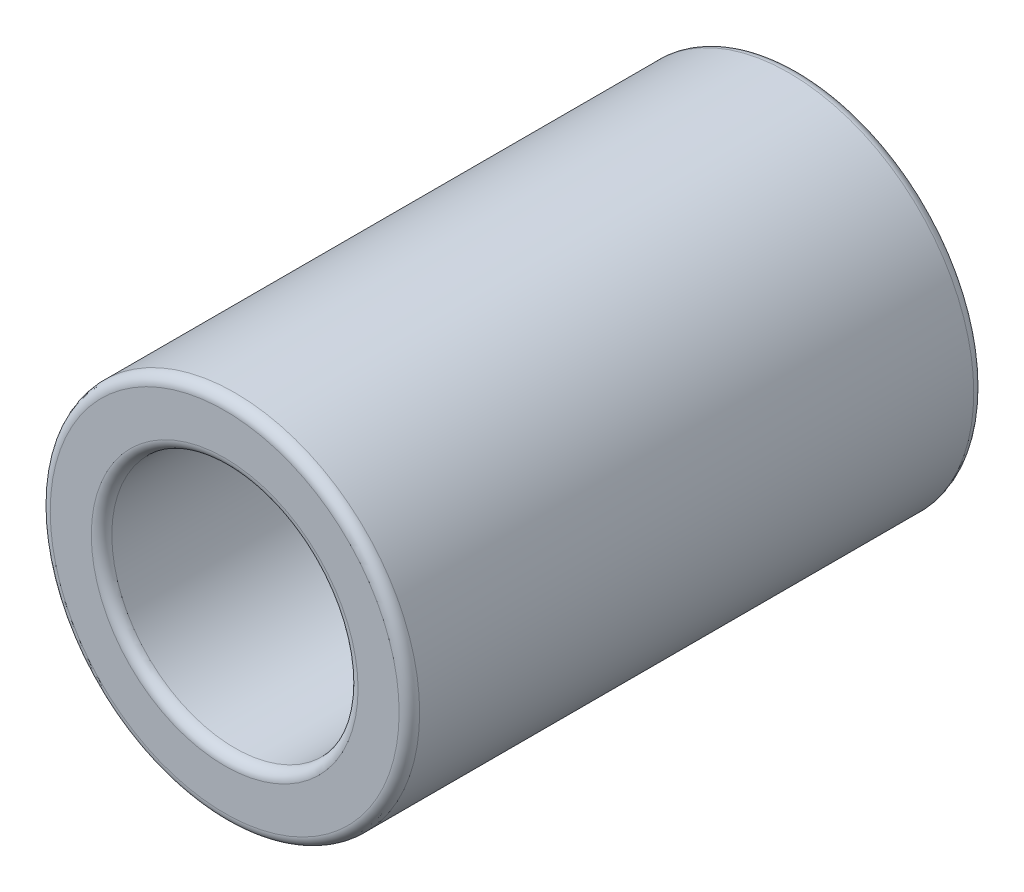
ISO-10303-21;
HEADER;
FILE_DESCRIPTION(('STEP AP214'),'2;1');
FILE_NAME('part.step','',(''),(''),'','','');
FILE_SCHEMA(('AUTOMOTIVE_DESIGN { 1 0 10303 214 1 1 1 1 }'));
ENDSEC;
DATA;
#1=APPLICATION_CONTEXT('core data for automotive mechanical design processes');
#2=APPLICATION_PROTOCOL_DEFINITION('international standard','automotive_design',2000,#1);
#3=PRODUCT_CONTEXT('',#1,'mechanical');
#4=PRODUCT('Part','Part','',(#3));
#5=PRODUCT_RELATED_PRODUCT_CATEGORY('part','',(#4));
#6=PRODUCT_DEFINITION_FORMATION('','',#4);
#7=PRODUCT_DEFINITION_CONTEXT('part definition',#1,'design');
#8=PRODUCT_DEFINITION('design','',#6,#7);
#9=PRODUCT_DEFINITION_SHAPE('','',#8);
#10=(LENGTH_UNIT() NAMED_UNIT(*) SI_UNIT(.MILLI.,.METRE.));
#11=(NAMED_UNIT(*) PLANE_ANGLE_UNIT() SI_UNIT($,.RADIAN.));
#12=(NAMED_UNIT(*) SI_UNIT($,.STERADIAN.) SOLID_ANGLE_UNIT());
#13=UNCERTAINTY_MEASURE_WITH_UNIT(LENGTH_MEASURE(1.E-05),#10,'distance_accuracy_value','');
#14=(GEOMETRIC_REPRESENTATION_CONTEXT(3) GLOBAL_UNCERTAINTY_ASSIGNED_CONTEXT((#13)) GLOBAL_UNIT_ASSIGNED_CONTEXT((#10,
#11,#12)) REPRESENTATION_CONTEXT('',''));
#15=CARTESIAN_POINT('',(0.,0.,0.));
#16=DIRECTION('',(0.,0.,1.));
#17=DIRECTION('',(1.,0.,0.));
#18=AXIS2_PLACEMENT_3D('',#15,#16,#17);
#19=CARTESIAN_POINT('',(0.,0.,28.));
#20=DIRECTION('',(0.,0.,1.));
#21=DIRECTION('',(1.,0.,0.));
#22=AXIS2_PLACEMENT_3D('',#19,#20,#21);
#23=PLANE('',#22);
#24=CARTESIAN_POINT('',(0.,0.,28.));
#25=DIRECTION('',(0.,0.,1.));
#26=DIRECTION('',(1.,0.,0.));
#27=AXIS2_PLACEMENT_3D('',#24,#25,#26);
#28=CIRCLE('',#27,17.);
#29=CARTESIAN_POINT('',(17.,0.,28.));
#30=VERTEX_POINT('',#29);
#31=EDGE_CURVE('E55',#30,#30,#28,.T.);
#32=ORIENTED_EDGE('',*,*,#31,.T.);
#33=EDGE_LOOP('',(#32));
#34=FACE_BOUND('',#33,.T.);
#35=CARTESIAN_POINT('',(0.,0.,28.));
#36=DIRECTION('',(0.,0.,1.));
#37=DIRECTION('',(1.,0.,0.));
#38=AXIS2_PLACEMENT_3D('',#35,#36,#37);
#39=CIRCLE('',#38,13.);
#40=CARTESIAN_POINT('',(13.,0.,28.));
#41=VERTEX_POINT('',#40);
#42=EDGE_CURVE('E59',#41,#41,#39,.F.);
#43=ORIENTED_EDGE('',*,*,#42,.T.);
#44=EDGE_LOOP('',(#43));
#45=FACE_BOUND('',#44,.T.);
#46=ADVANCED_FACE('F44',(#34,#45),#23,.T.);
#47=CARTESIAN_POINT('',(0.,0.,-28.));
#48=DIRECTION('',(0.,0.,1.));
#49=DIRECTION('',(1.,0.,0.));
#50=AXIS2_PLACEMENT_3D('',#47,#48,#49);
#51=PLANE('',#50);
#52=CARTESIAN_POINT('',(0.,0.,-28.));
#53=DIRECTION('',(0.,0.,1.));
#54=DIRECTION('',(1.,0.,0.));
#55=AXIS2_PLACEMENT_3D('',#52,#53,#54);
#56=CIRCLE('',#55,17.);
#57=CARTESIAN_POINT('',(17.,0.,-28.));
#58=VERTEX_POINT('',#57);
#59=EDGE_CURVE('E64',#58,#58,#56,.F.);
#60=ORIENTED_EDGE('',*,*,#59,.T.);
#61=EDGE_LOOP('',(#60));
#62=FACE_BOUND('',#61,.T.);
#63=CARTESIAN_POINT('',(0.,0.,-28.));
#64=DIRECTION('',(0.,0.,1.));
#65=DIRECTION('',(1.,0.,0.));
#66=AXIS2_PLACEMENT_3D('',#63,#64,#65);
#67=CIRCLE('',#66,13.);
#68=CARTESIAN_POINT('',(13.,0.,-28.));
#69=VERTEX_POINT('',#68);
#70=EDGE_CURVE('E67',#69,#69,#67,.T.);
#71=ORIENTED_EDGE('',*,*,#70,.T.);
#72=EDGE_LOOP('',(#71));
#73=FACE_BOUND('',#72,.T.);
#74=ADVANCED_FACE('F89',(#62,#73),#51,.F.);
#75=CARTESIAN_POINT('',(0.,0.,28.));
#76=DIRECTION('',(0.,0.,-1.));
#77=DIRECTION('',(-1.,0.,0.));
#78=AXIS2_PLACEMENT_3D('',#75,#76,#77);
#79=CYLINDRICAL_SURFACE('',#78,18.);
#80=CARTESIAN_POINT('',(0.,0.,-27.));
#81=DIRECTION('',(0.,0.,1.));
#82=DIRECTION('',(1.,0.,0.));
#83=AXIS2_PLACEMENT_3D('',#80,#81,#82);
#84=CIRCLE('',#83,18.);
#85=CARTESIAN_POINT('',(18.,0.,-27.));
#86=VERTEX_POINT('',#85);
#87=EDGE_CURVE('E70',#86,#86,#84,.T.);
#88=ORIENTED_EDGE('',*,*,#87,.T.);
#89=EDGE_LOOP('',(#88));
#90=FACE_BOUND('',#89,.T.);
#91=CARTESIAN_POINT('',(0.,0.,27.));
#92=DIRECTION('',(0.,0.,1.));
#93=DIRECTION('',(1.,0.,0.));
#94=AXIS2_PLACEMENT_3D('',#91,#92,#93);
#95=CIRCLE('',#94,18.);
#96=CARTESIAN_POINT('',(18.,0.,27.));
#97=VERTEX_POINT('',#96);
#98=EDGE_CURVE('E73',#97,#97,#95,.F.);
#99=ORIENTED_EDGE('',*,*,#98,.T.);
#100=EDGE_LOOP('',(#99));
#101=FACE_BOUND('',#100,.T.);
#102=ADVANCED_FACE('F77',(#90,#101),#79,.T.);
#103=CARTESIAN_POINT('',(0.,0.,28.));
#104=DIRECTION('',(0.,0.,-1.));
#105=DIRECTION('',(-1.,0.,0.));
#106=AXIS2_PLACEMENT_3D('',#103,#104,#105);
#107=CYLINDRICAL_SURFACE('',#106,12.);
#108=CARTESIAN_POINT('',(0.,0.,-27.));
#109=DIRECTION('',(0.,0.,1.));
#110=DIRECTION('',(1.,0.,0.));
#111=AXIS2_PLACEMENT_3D('',#108,#109,#110);
#112=CIRCLE('',#111,12.);
#113=CARTESIAN_POINT('',(12.,0.,-27.));
#114=VERTEX_POINT('',#113);
#115=EDGE_CURVE('E12',#114,#114,#112,.F.);
#116=ORIENTED_EDGE('',*,*,#115,.T.);
#117=EDGE_LOOP('',(#116));
#118=FACE_BOUND('',#117,.T.);
#119=CARTESIAN_POINT('',(0.,0.,27.));
#120=DIRECTION('',(0.,0.,1.));
#121=DIRECTION('',(1.,0.,0.));
#122=AXIS2_PLACEMENT_3D('',#119,#120,#121);
#123=CIRCLE('',#122,12.);
#124=CARTESIAN_POINT('',(12.,0.,27.));
#125=VERTEX_POINT('',#124);
#126=EDGE_CURVE('E51',#125,#125,#123,.T.);
#127=ORIENTED_EDGE('',*,*,#126,.T.);
#128=EDGE_LOOP('',(#127));
#129=FACE_BOUND('',#128,.T.);
#130=ADVANCED_FACE('F105',(#118,#129),#107,.F.);
#131=CARTESIAN_POINT('',(0.,0.,-27.));
#132=DIRECTION('',(0.,0.,1.));
#133=DIRECTION('',(1.,0.,0.));
#134=AXIS2_PLACEMENT_3D('',#131,#132,#133);
#135=TOROIDAL_SURFACE('',#134,17.,1.);
#136=ORIENTED_EDGE('',*,*,#59,.F.);
#137=EDGE_LOOP('',(#136));
#138=FACE_BOUND('',#137,.T.);
#139=ORIENTED_EDGE('',*,*,#87,.F.);
#140=EDGE_LOOP('',(#139));
#141=FACE_BOUND('',#140,.T.);
#142=ADVANCED_FACE('F83',(#138,#141),#135,.T.);
#143=CARTESIAN_POINT('',(0.,0.,27.));
#144=DIRECTION('',(0.,0.,1.));
#145=DIRECTION('',(1.,0.,0.));
#146=AXIS2_PLACEMENT_3D('',#143,#144,#145);
#147=TOROIDAL_SURFACE('',#146,17.,1.);
#148=ORIENTED_EDGE('',*,*,#98,.F.);
#149=EDGE_LOOP('',(#148));
#150=FACE_BOUND('',#149,.T.);
#151=ORIENTED_EDGE('',*,*,#31,.F.);
#152=EDGE_LOOP('',(#151));
#153=FACE_BOUND('',#152,.T.);
#154=ADVANCED_FACE('F79',(#150,#153),#147,.T.);
#155=CARTESIAN_POINT('',(0.,0.,-27.));
#156=DIRECTION('',(0.,0.,1.));
#157=DIRECTION('',(1.,0.,0.));
#158=AXIS2_PLACEMENT_3D('',#155,#156,#157);
#159=TOROIDAL_SURFACE('',#158,13.,1.);
#160=ORIENTED_EDGE('',*,*,#115,.F.);
#161=EDGE_LOOP('',(#160));
#162=FACE_BOUND('',#161,.T.);
#163=ORIENTED_EDGE('',*,*,#70,.F.);
#164=EDGE_LOOP('',(#163));
#165=FACE_BOUND('',#164,.T.);
#166=ADVANCED_FACE('F82',(#162,#165),#159,.T.);
#167=CARTESIAN_POINT('',(0.,0.,27.));
#168=DIRECTION('',(0.,0.,1.));
#169=DIRECTION('',(1.,0.,0.));
#170=AXIS2_PLACEMENT_3D('',#167,#168,#169);
#171=TOROIDAL_SURFACE('',#170,13.,1.);
#172=ORIENTED_EDGE('',*,*,#42,.F.);
#173=EDGE_LOOP('',(#172));
#174=FACE_BOUND('',#173,.T.);
#175=ORIENTED_EDGE('',*,*,#126,.F.);
#176=EDGE_LOOP('',(#175));
#177=FACE_BOUND('',#176,.T.);
#178=ADVANCED_FACE('F46',(#174,#177),#171,.T.);
#179=CLOSED_SHELL('',(#46,#74,#102,#130,#142,#154,#166,#178));
#180=MANIFOLD_SOLID_BREP('B2',#179);
#181=ADVANCED_BREP_SHAPE_REPRESENTATION('',(#18,#180),#14);
#182=SHAPE_DEFINITION_REPRESENTATION(#9,#181);
ENDSEC;
END-ISO-10303-21;
